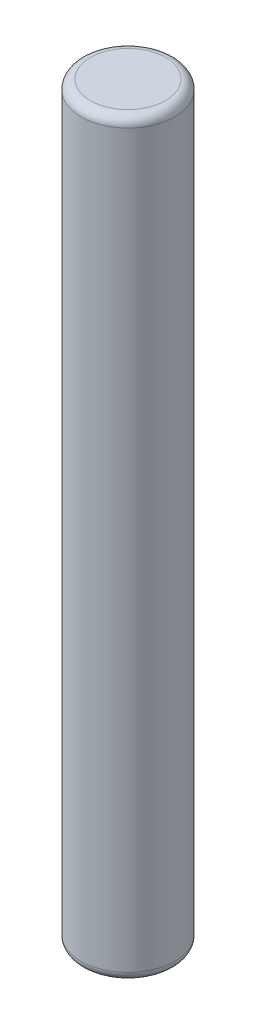
ISO-10303-21;
HEADER;
FILE_DESCRIPTION(('STEP AP214'),'2;1');
FILE_NAME('part.step','',(''),(''),'','','');
FILE_SCHEMA(('AUTOMOTIVE_DESIGN { 1 0 10303 214 1 1 1 1 }'));
ENDSEC;
DATA;
#1=APPLICATION_CONTEXT('core data for automotive mechanical design processes');
#2=APPLICATION_PROTOCOL_DEFINITION('international standard','automotive_design',2000,#1);
#3=PRODUCT_CONTEXT('',#1,'mechanical');
#4=PRODUCT('Part','Part','',(#3));
#5=PRODUCT_RELATED_PRODUCT_CATEGORY('part','',(#4));
#6=PRODUCT_DEFINITION_FORMATION('','',#4);
#7=PRODUCT_DEFINITION_CONTEXT('part definition',#1,'design');
#8=PRODUCT_DEFINITION('design','',#6,#7);
#9=PRODUCT_DEFINITION_SHAPE('','',#8);
#10=(LENGTH_UNIT() NAMED_UNIT(*) SI_UNIT(.MILLI.,.METRE.));
#11=(NAMED_UNIT(*) PLANE_ANGLE_UNIT() SI_UNIT($,.RADIAN.));
#12=(NAMED_UNIT(*) SI_UNIT($,.STERADIAN.) SOLID_ANGLE_UNIT());
#13=UNCERTAINTY_MEASURE_WITH_UNIT(LENGTH_MEASURE(1.E-05),#10,'distance_accuracy_value','');
#14=(GEOMETRIC_REPRESENTATION_CONTEXT(3) GLOBAL_UNCERTAINTY_ASSIGNED_CONTEXT((#13)) GLOBAL_UNIT_ASSIGNED_CONTEXT((#10,
#11,#12)) REPRESENTATION_CONTEXT('',''));
#15=CARTESIAN_POINT('',(0.,0.,0.));
#16=DIRECTION('',(0.,0.,1.));
#17=DIRECTION('',(1.,0.,0.));
#18=AXIS2_PLACEMENT_3D('',#15,#16,#17);
#19=CARTESIAN_POINT('',(0.,40.,0.));
#20=DIRECTION('',(0.,-1.,0.));
#21=DIRECTION('',(0.,0.,-1.));
#22=AXIS2_PLACEMENT_3D('',#19,#20,#21);
#23=CYLINDRICAL_SURFACE('',#22,2.5);
#24=CARTESIAN_POINT('',(0.,0.5,0.));
#25=DIRECTION('',(0.,1.,0.));
#26=DIRECTION('',(0.,0.,1.));
#27=AXIS2_PLACEMENT_3D('',#24,#25,#26);
#28=CIRCLE('',#27,2.5);
#29=CARTESIAN_POINT('',(0.,0.5,2.5));
#30=VERTEX_POINT('',#29);
#31=EDGE_CURVE('E43',#30,#30,#28,.T.);
#32=ORIENTED_EDGE('',*,*,#31,.T.);
#33=EDGE_LOOP('',(#32));
#34=FACE_BOUND('',#33,.T.);
#35=CARTESIAN_POINT('',(0.,39.5,0.));
#36=DIRECTION('',(0.,1.,0.));
#37=DIRECTION('',(0.,0.,1.));
#38=AXIS2_PLACEMENT_3D('',#35,#36,#37);
#39=CIRCLE('',#38,2.5);
#40=CARTESIAN_POINT('',(0.,39.5,2.5));
#41=VERTEX_POINT('',#40);
#42=EDGE_CURVE('E47',#41,#41,#39,.F.);
#43=ORIENTED_EDGE('',*,*,#42,.T.);
#44=EDGE_LOOP('',(#43));
#45=FACE_BOUND('',#44,.T.);
#46=ADVANCED_FACE('F32',(#34,#45),#23,.T.);
#47=CARTESIAN_POINT('',(0.,40.,0.));
#48=DIRECTION('',(0.,1.,0.));
#49=DIRECTION('',(0.,0.,1.));
#50=AXIS2_PLACEMENT_3D('',#47,#48,#49);
#51=PLANE('',#50);
#52=CARTESIAN_POINT('',(0.,40.,0.));
#53=DIRECTION('',(0.,1.,0.));
#54=DIRECTION('',(0.,0.,1.));
#55=AXIS2_PLACEMENT_3D('',#52,#53,#54);
#56=CIRCLE('',#55,2.);
#57=CARTESIAN_POINT('',(0.,40.,2.));
#58=VERTEX_POINT('',#57);
#59=EDGE_CURVE('E10',#58,#58,#56,.T.);
#60=ORIENTED_EDGE('',*,*,#59,.T.);
#61=EDGE_LOOP('',(#60));
#62=FACE_BOUND('',#61,.T.);
#63=ADVANCED_FACE('F63',(#62),#51,.T.);
#64=CARTESIAN_POINT('',(0.,0.,0.));
#65=DIRECTION('',(0.,1.,0.));
#66=DIRECTION('',(0.,0.,1.));
#67=AXIS2_PLACEMENT_3D('',#64,#65,#66);
#68=PLANE('',#67);
#69=CARTESIAN_POINT('',(0.,0.,0.));
#70=DIRECTION('',(0.,1.,0.));
#71=DIRECTION('',(0.,0.,1.));
#72=AXIS2_PLACEMENT_3D('',#69,#70,#71);
#73=CIRCLE('',#72,2.);
#74=CARTESIAN_POINT('',(0.,0.,2.));
#75=VERTEX_POINT('',#74);
#76=EDGE_CURVE('E39',#75,#75,#73,.F.);
#77=ORIENTED_EDGE('',*,*,#76,.T.);
#78=EDGE_LOOP('',(#77));
#79=FACE_BOUND('',#78,.T.);
#80=ADVANCED_FACE('F60',(#79),#68,.F.);
#81=CARTESIAN_POINT('',(0.,0.5,0.));
#82=DIRECTION('',(0.,1.,0.));
#83=DIRECTION('',(0.,0.,1.));
#84=AXIS2_PLACEMENT_3D('',#81,#82,#83);
#85=TOROIDAL_SURFACE('',#84,2.,0.5);
#86=ORIENTED_EDGE('',*,*,#76,.F.);
#87=EDGE_LOOP('',(#86));
#88=FACE_BOUND('',#87,.T.);
#89=ORIENTED_EDGE('',*,*,#31,.F.);
#90=EDGE_LOOP('',(#89));
#91=FACE_BOUND('',#90,.T.);
#92=ADVANCED_FACE('F56',(#88,#91),#85,.T.);
#93=CARTESIAN_POINT('',(0.,39.5,0.));
#94=DIRECTION('',(0.,1.,0.));
#95=DIRECTION('',(0.,0.,1.));
#96=AXIS2_PLACEMENT_3D('',#93,#94,#95);
#97=TOROIDAL_SURFACE('',#96,2.,0.5);
#98=ORIENTED_EDGE('',*,*,#42,.F.);
#99=EDGE_LOOP('',(#98));
#100=FACE_BOUND('',#99,.T.);
#101=ORIENTED_EDGE('',*,*,#59,.F.);
#102=EDGE_LOOP('',(#101));
#103=FACE_BOUND('',#102,.T.);
#104=ADVANCED_FACE('F34',(#100,#103),#97,.T.);
#105=CLOSED_SHELL('',(#46,#63,#80,#92,#104));
#106=MANIFOLD_SOLID_BREP('B2',#105);
#107=ADVANCED_BREP_SHAPE_REPRESENTATION('',(#18,#106),#14);
#108=SHAPE_DEFINITION_REPRESENTATION(#9,#107);
ENDSEC;
END-ISO-10303-21;
